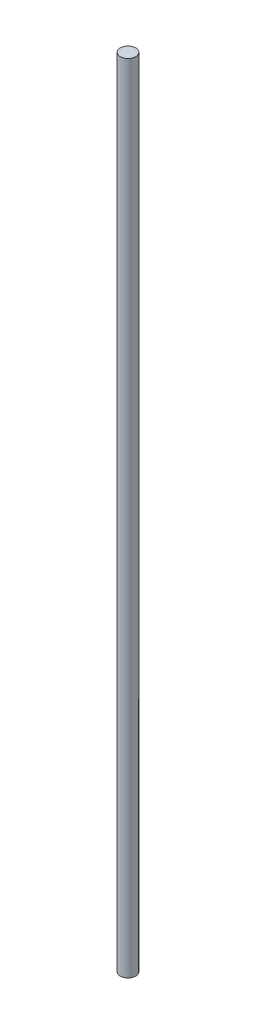
ISO-10303-21;
HEADER;
FILE_DESCRIPTION(('STEP AP214'),'2;1');
FILE_NAME('part.step','',(''),(''),'','','');
FILE_SCHEMA(('AUTOMOTIVE_DESIGN { 1 0 10303 214 1 1 1 1 }'));
ENDSEC;
DATA;
#1=APPLICATION_CONTEXT('core data for automotive mechanical design processes');
#2=APPLICATION_PROTOCOL_DEFINITION('international standard','automotive_design',2000,#1);
#3=PRODUCT_CONTEXT('',#1,'mechanical');
#4=PRODUCT('Part','Part','',(#3));
#5=PRODUCT_RELATED_PRODUCT_CATEGORY('part','',(#4));
#6=PRODUCT_DEFINITION_FORMATION('','',#4);
#7=PRODUCT_DEFINITION_CONTEXT('part definition',#1,'design');
#8=PRODUCT_DEFINITION('design','',#6,#7);
#9=PRODUCT_DEFINITION_SHAPE('','',#8);
#10=(LENGTH_UNIT() NAMED_UNIT(*) SI_UNIT(.MILLI.,.METRE.));
#11=(NAMED_UNIT(*) PLANE_ANGLE_UNIT() SI_UNIT($,.RADIAN.));
#12=(NAMED_UNIT(*) SI_UNIT($,.STERADIAN.) SOLID_ANGLE_UNIT());
#13=UNCERTAINTY_MEASURE_WITH_UNIT(LENGTH_MEASURE(1.E-05),#10,'distance_accuracy_value','');
#14=(GEOMETRIC_REPRESENTATION_CONTEXT(3) GLOBAL_UNCERTAINTY_ASSIGNED_CONTEXT((#13)) GLOBAL_UNIT_ASSIGNED_CONTEXT((#10,
#11,#12)) REPRESENTATION_CONTEXT('',''));
#15=CARTESIAN_POINT('',(0.,0.,0.));
#16=DIRECTION('',(0.,0.,1.));
#17=DIRECTION('',(1.,0.,0.));
#18=AXIS2_PLACEMENT_3D('',#15,#16,#17);
#19=CARTESIAN_POINT('',(0.,660.4,0.));
#20=DIRECTION('',(0.,-1.,0.));
#21=DIRECTION('',(0.,0.,-1.));
#22=AXIS2_PLACEMENT_3D('',#19,#20,#21);
#23=CYLINDRICAL_SURFACE('',#22,6.35);
#24=CARTESIAN_POINT('',(0.,660.4,0.));
#25=DIRECTION('',(0.,1.,0.));
#26=DIRECTION('',(0.,0.,1.));
#27=AXIS2_PLACEMENT_3D('',#24,#25,#26);
#28=CIRCLE('',#27,6.35);
#29=CARTESIAN_POINT('',(0.,660.4,6.35));
#30=VERTEX_POINT('',#29);
#31=EDGE_CURVE('E10',#30,#30,#28,.T.);
#32=ORIENTED_EDGE('',*,*,#31,.F.);
#33=EDGE_LOOP('',(#32));
#34=FACE_BOUND('',#33,.T.);
#35=CARTESIAN_POINT('',(0.,0.,0.));
#36=DIRECTION('',(0.,1.,0.));
#37=DIRECTION('',(0.,0.,1.));
#38=AXIS2_PLACEMENT_3D('',#35,#36,#37);
#39=CIRCLE('',#38,6.35);
#40=CARTESIAN_POINT('',(0.,0.,6.35));
#41=VERTEX_POINT('',#40);
#42=EDGE_CURVE('E34',#41,#41,#39,.T.);
#43=ORIENTED_EDGE('',*,*,#42,.T.);
#44=EDGE_LOOP('',(#43));
#45=FACE_BOUND('',#44,.T.);
#46=ADVANCED_FACE('F31',(#34,#45),#23,.T.);
#47=CARTESIAN_POINT('',(0.,660.4,0.));
#48=DIRECTION('',(0.,1.,0.));
#49=DIRECTION('',(0.,0.,1.));
#50=AXIS2_PLACEMENT_3D('',#47,#48,#49);
#51=PLANE('',#50);
#52=ORIENTED_EDGE('',*,*,#31,.T.);
#53=EDGE_LOOP('',(#52));
#54=FACE_BOUND('',#53,.T.);
#55=ADVANCED_FACE('F46',(#54),#51,.T.);
#56=CARTESIAN_POINT('',(0.,0.,0.));
#57=DIRECTION('',(0.,1.,0.));
#58=DIRECTION('',(0.,0.,1.));
#59=AXIS2_PLACEMENT_3D('',#56,#57,#58);
#60=PLANE('',#59);
#61=ORIENTED_EDGE('',*,*,#42,.F.);
#62=EDGE_LOOP('',(#61));
#63=FACE_BOUND('',#62,.T.);
#64=ADVANCED_FACE('F44',(#63),#60,.F.);
#65=CLOSED_SHELL('',(#46,#55,#64));
#66=MANIFOLD_SOLID_BREP('B2',#65);
#67=ADVANCED_BREP_SHAPE_REPRESENTATION('',(#18,#66),#14);
#68=SHAPE_DEFINITION_REPRESENTATION(#9,#67);
ENDSEC;
END-ISO-10303-21;
